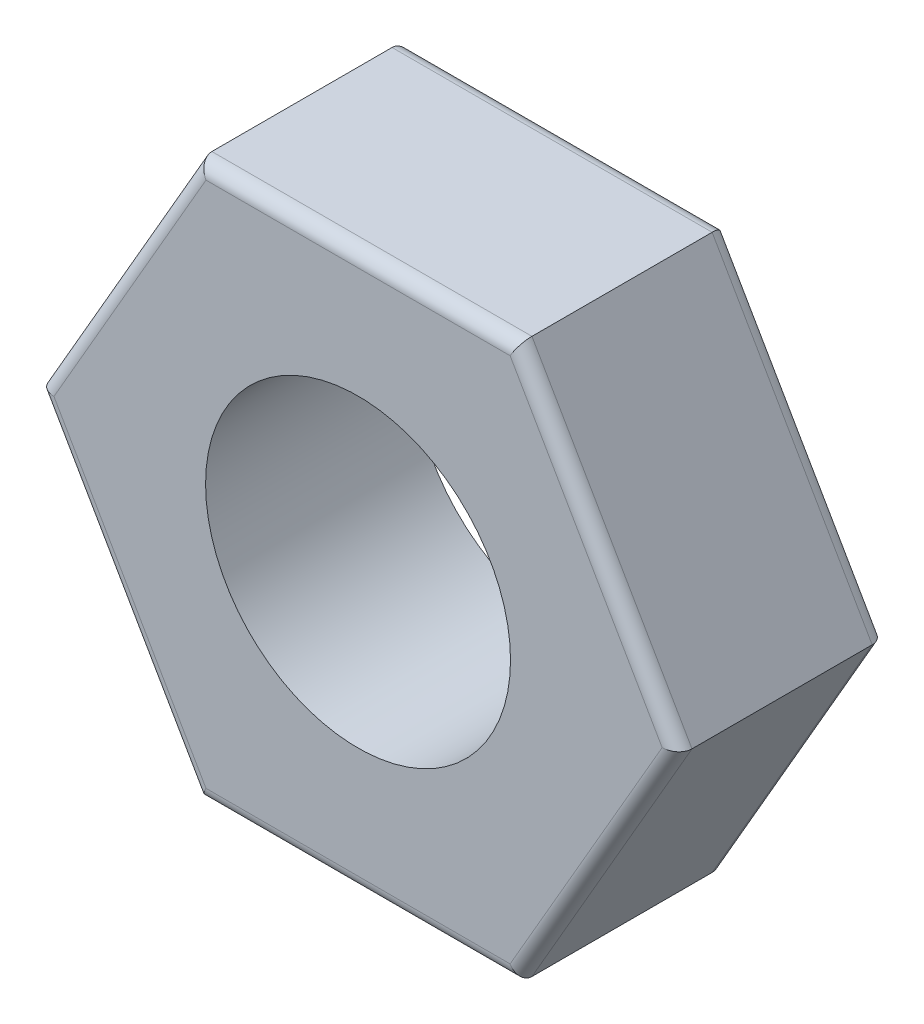
ISO-10303-21;
HEADER;
FILE_DESCRIPTION(('STEP AP214'),'2;1');
FILE_NAME('part.step','',(''),(''),'','','');
FILE_SCHEMA(('AUTOMOTIVE_DESIGN { 1 0 10303 214 1 1 1 1 }'));
ENDSEC;
DATA;
#1=APPLICATION_CONTEXT('core data for automotive mechanical design processes');
#2=APPLICATION_PROTOCOL_DEFINITION('international standard','automotive_design',2000,#1);
#3=PRODUCT_CONTEXT('',#1,'mechanical');
#4=PRODUCT('Part','Part','',(#3));
#5=PRODUCT_RELATED_PRODUCT_CATEGORY('part','',(#4));
#6=PRODUCT_DEFINITION_FORMATION('','',#4);
#7=PRODUCT_DEFINITION_CONTEXT('part definition',#1,'design');
#8=PRODUCT_DEFINITION('design','',#6,#7);
#9=PRODUCT_DEFINITION_SHAPE('','',#8);
#10=(LENGTH_UNIT() NAMED_UNIT(*) SI_UNIT(.MILLI.,.METRE.));
#11=(NAMED_UNIT(*) PLANE_ANGLE_UNIT() SI_UNIT($,.RADIAN.));
#12=(NAMED_UNIT(*) SI_UNIT($,.STERADIAN.) SOLID_ANGLE_UNIT());
#13=UNCERTAINTY_MEASURE_WITH_UNIT(LENGTH_MEASURE(1.E-05),#10,'distance_accuracy_value','');
#14=(GEOMETRIC_REPRESENTATION_CONTEXT(3) GLOBAL_UNCERTAINTY_ASSIGNED_CONTEXT((#13)) GLOBAL_UNIT_ASSIGNED_CONTEXT((#10,
#11,#12)) REPRESENTATION_CONTEXT('',''));
#15=CARTESIAN_POINT('',(0.,0.,0.));
#16=DIRECTION('',(0.,0.,1.));
#17=DIRECTION('',(1.,0.,0.));
#18=AXIS2_PLACEMENT_3D('',#15,#16,#17);
#19=CARTESIAN_POINT('',(-11.5470053837925,-20.,15.));
#20=DIRECTION('',(0.,1.,0.));
#21=DIRECTION('',(-1.,0.,0.));
#22=AXIS2_PLACEMENT_3D('',#19,#20,#21);
#23=PLANE('',#22);
#24=DIRECTION('',(0.,0.,-1.));
#25=VECTOR('',#24,1.);
#26=CARTESIAN_POINT('',(-11.5470053837925,-20.,15.));
#27=LINE('',#26,#25);
#28=CARTESIAN_POINT('',(-11.5470053837925,-20.,14.));
#29=VERTEX_POINT('',#28);
#30=CARTESIAN_POINT('',(-11.5470053837925,-20.,1.));
#31=VERTEX_POINT('',#30);
#32=EDGE_CURVE('E176',#29,#31,#27,.T.);
#33=ORIENTED_EDGE('',*,*,#32,.T.);
#34=DIRECTION('',(1.,0.,0.));
#35=VECTOR('',#34,1.);
#36=CARTESIAN_POINT('',(-11.5470053837925,-20.,1.));
#37=LINE('',#36,#35);
#38=CARTESIAN_POINT('',(11.5470053837925,-20.,1.));
#39=VERTEX_POINT('',#38);
#40=EDGE_CURVE('E206',#31,#39,#37,.T.);
#41=ORIENTED_EDGE('',*,*,#40,.T.);
#42=DIRECTION('',(0.,0.,-1.));
#43=VECTOR('',#42,1.);
#44=CARTESIAN_POINT('',(11.5470053837925,-20.,15.));
#45=LINE('',#44,#43);
#46=CARTESIAN_POINT('',(11.5470053837925,-20.,14.));
#47=VERTEX_POINT('',#46);
#48=EDGE_CURVE('E158',#47,#39,#45,.T.);
#49=ORIENTED_EDGE('',*,*,#48,.F.);
#50=DIRECTION('',(1.,0.,0.));
#51=VECTOR('',#50,1.);
#52=CARTESIAN_POINT('',(-11.5470053837925,-20.,14.));
#53=LINE('',#52,#51);
#54=EDGE_CURVE('E208',#47,#29,#53,.F.);
#55=ORIENTED_EDGE('',*,*,#54,.T.);
#56=EDGE_LOOP('',(#33,#41,#49,#55));
#57=FACE_BOUND('',#56,.T.);
#58=ADVANCED_FACE('F34',(#57),#23,.F.);
#59=CARTESIAN_POINT('',(11.5470053837925,-20.,15.));
#60=DIRECTION('',(-0.866025403784439,0.5,0.));
#61=DIRECTION('',(-0.5,-0.866025403784439,0.));
#62=AXIS2_PLACEMENT_3D('',#59,#60,#61);
#63=PLANE('',#62);
#64=ORIENTED_EDGE('',*,*,#48,.T.);
#65=DIRECTION('',(0.5,0.866025403784439,0.));
#66=VECTOR('',#65,1.);
#67=CARTESIAN_POINT('',(11.5470053837925,-20.,1.));
#68=LINE('',#67,#66);
#69=CARTESIAN_POINT('',(23.094010767585,0.,1.));
#70=VERTEX_POINT('',#69);
#71=EDGE_CURVE('E210',#39,#70,#68,.T.);
#72=ORIENTED_EDGE('',*,*,#71,.T.);
#73=DIRECTION('',(0.,0.,-1.));
#74=VECTOR('',#73,1.);
#75=CARTESIAN_POINT('',(23.094010767585,0.,15.));
#76=LINE('',#75,#74);
#77=CARTESIAN_POINT('',(23.094010767585,0.,14.));
#78=VERTEX_POINT('',#77);
#79=EDGE_CURVE('E148',#78,#70,#76,.T.);
#80=ORIENTED_EDGE('',*,*,#79,.F.);
#81=DIRECTION('',(0.5,0.866025403784439,0.));
#82=VECTOR('',#81,1.);
#83=CARTESIAN_POINT('',(11.5470053837925,-20.,14.));
#84=LINE('',#83,#82);
#85=EDGE_CURVE('E212',#78,#47,#84,.F.);
#86=ORIENTED_EDGE('',*,*,#85,.T.);
#87=EDGE_LOOP('',(#64,#72,#80,#86));
#88=FACE_BOUND('',#87,.T.);
#89=ADVANCED_FACE('F267',(#88),#63,.F.);
#90=CARTESIAN_POINT('',(23.094010767585,0.,15.));
#91=DIRECTION('',(-0.866025403784439,-0.5,0.));
#92=DIRECTION('',(0.5,-0.866025403784439,0.));
#93=AXIS2_PLACEMENT_3D('',#90,#91,#92);
#94=PLANE('',#93);
#95=ORIENTED_EDGE('',*,*,#79,.T.);
#96=DIRECTION('',(-0.5,0.866025403784439,0.));
#97=VECTOR('',#96,1.);
#98=CARTESIAN_POINT('',(23.094010767585,0.,1.));
#99=LINE('',#98,#97);
#100=CARTESIAN_POINT('',(11.5470053837925,20.,1.));
#101=VERTEX_POINT('',#100);
#102=EDGE_CURVE('E147',#70,#101,#99,.T.);
#103=ORIENTED_EDGE('',*,*,#102,.T.);
#104=DIRECTION('',(0.,0.,-1.));
#105=VECTOR('',#104,1.);
#106=CARTESIAN_POINT('',(11.5470053837925,20.,15.));
#107=LINE('',#106,#105);
#108=CARTESIAN_POINT('',(11.5470053837925,20.,14.));
#109=VERTEX_POINT('',#108);
#110=EDGE_CURVE('E129',#109,#101,#107,.T.);
#111=ORIENTED_EDGE('',*,*,#110,.F.);
#112=DIRECTION('',(-0.5,0.866025403784439,0.));
#113=VECTOR('',#112,1.);
#114=CARTESIAN_POINT('',(23.094010767585,0.,14.));
#115=LINE('',#114,#113);
#116=EDGE_CURVE('E144',#109,#78,#115,.F.);
#117=ORIENTED_EDGE('',*,*,#116,.T.);
#118=EDGE_LOOP('',(#95,#103,#111,#117));
#119=FACE_BOUND('',#118,.T.);
#120=ADVANCED_FACE('F143',(#119),#94,.F.);
#121=CARTESIAN_POINT('',(11.5470053837925,20.,15.));
#122=DIRECTION('',(0.,-1.,0.));
#123=DIRECTION('',(0.,0.,-1.));
#124=AXIS2_PLACEMENT_3D('',#121,#122,#123);
#125=PLANE('',#124);
#126=ORIENTED_EDGE('',*,*,#110,.T.);
#127=DIRECTION('',(-1.,0.,0.));
#128=VECTOR('',#127,1.);
#129=CARTESIAN_POINT('',(11.5470053837925,20.,1.));
#130=LINE('',#129,#128);
#131=CARTESIAN_POINT('',(-11.5470053837925,20.,1.));
#132=VERTEX_POINT('',#131);
#133=EDGE_CURVE('E136',#101,#132,#130,.T.);
#134=ORIENTED_EDGE('',*,*,#133,.T.);
#135=DIRECTION('',(0.,0.,-1.));
#136=VECTOR('',#135,1.);
#137=CARTESIAN_POINT('',(-11.5470053837925,20.,15.));
#138=LINE('',#137,#136);
#139=CARTESIAN_POINT('',(-11.5470053837925,20.,14.));
#140=VERTEX_POINT('',#139);
#141=EDGE_CURVE('E131',#140,#132,#138,.T.);
#142=ORIENTED_EDGE('',*,*,#141,.F.);
#143=DIRECTION('',(-1.,0.,0.));
#144=VECTOR('',#143,1.);
#145=CARTESIAN_POINT('',(11.5470053837925,20.,14.));
#146=LINE('',#145,#144);
#147=EDGE_CURVE('E126',#140,#109,#146,.F.);
#148=ORIENTED_EDGE('',*,*,#147,.T.);
#149=EDGE_LOOP('',(#126,#134,#142,#148));
#150=FACE_BOUND('',#149,.T.);
#151=ADVANCED_FACE('F128',(#150),#125,.F.);
#152=CARTESIAN_POINT('',(-11.5470053837925,20.,15.));
#153=DIRECTION('',(0.866025403784439,-0.5,0.));
#154=DIRECTION('',(0.5,0.866025403784439,0.));
#155=AXIS2_PLACEMENT_3D('',#152,#153,#154);
#156=PLANE('',#155);
#157=ORIENTED_EDGE('',*,*,#141,.T.);
#158=DIRECTION('',(-0.5,-0.866025403784439,0.));
#159=VECTOR('',#158,1.);
#160=CARTESIAN_POINT('',(-11.5470053837925,20.,1.));
#161=LINE('',#160,#159);
#162=CARTESIAN_POINT('',(-23.094010767585,0.,1.));
#163=VERTEX_POINT('',#162);
#164=EDGE_CURVE('E137',#132,#163,#161,.T.);
#165=ORIENTED_EDGE('',*,*,#164,.T.);
#166=DIRECTION('',(0.,0.,-1.));
#167=VECTOR('',#166,1.);
#168=CARTESIAN_POINT('',(-23.094010767585,0.,15.));
#169=LINE('',#168,#167);
#170=CARTESIAN_POINT('',(-23.094010767585,0.,14.));
#171=VERTEX_POINT('',#170);
#172=EDGE_CURVE('E232',#171,#163,#169,.T.);
#173=ORIENTED_EDGE('',*,*,#172,.F.);
#174=DIRECTION('',(-0.5,-0.866025403784439,0.));
#175=VECTOR('',#174,1.);
#176=CARTESIAN_POINT('',(-11.5470053837925,20.,14.));
#177=LINE('',#176,#175);
#178=EDGE_CURVE('E200',#171,#140,#177,.F.);
#179=ORIENTED_EDGE('',*,*,#178,.T.);
#180=EDGE_LOOP('',(#157,#165,#173,#179));
#181=FACE_BOUND('',#180,.T.);
#182=ADVANCED_FACE('F332',(#181),#156,.F.);
#183=CARTESIAN_POINT('',(-23.094010767585,0.,15.));
#184=DIRECTION('',(0.866025403784438,0.5,0.));
#185=DIRECTION('',(-0.5,0.866025403784439,0.));
#186=AXIS2_PLACEMENT_3D('',#183,#184,#185);
#187=PLANE('',#186);
#188=ORIENTED_EDGE('',*,*,#172,.T.);
#189=DIRECTION('',(0.5,-0.866025403784439,0.));
#190=VECTOR('',#189,1.);
#191=CARTESIAN_POINT('',(-23.094010767585,0.,1.));
#192=LINE('',#191,#190);
#193=EDGE_CURVE('E202',#163,#31,#192,.T.);
#194=ORIENTED_EDGE('',*,*,#193,.T.);
#195=ORIENTED_EDGE('',*,*,#32,.F.);
#196=DIRECTION('',(0.5,-0.866025403784439,0.));
#197=VECTOR('',#196,1.);
#198=CARTESIAN_POINT('',(-23.094010767585,0.,14.));
#199=LINE('',#198,#197);
#200=EDGE_CURVE('E204',#29,#171,#199,.F.);
#201=ORIENTED_EDGE('',*,*,#200,.T.);
#202=EDGE_LOOP('',(#188,#194,#195,#201));
#203=FACE_BOUND('',#202,.T.);
#204=ADVANCED_FACE('F255',(#203),#187,.F.);
#205=CARTESIAN_POINT('',(0.,0.,15.));
#206=DIRECTION('',(0.,0.,1.));
#207=DIRECTION('',(1.,0.,0.));
#208=AXIS2_PLACEMENT_3D('',#205,#206,#207);
#209=PLANE('',#208);
#210=CARTESIAN_POINT('',(0.,0.,15.));
#211=DIRECTION('',(0.,0.,1.));
#212=DIRECTION('',(1.,0.,0.));
#213=AXIS2_PLACEMENT_3D('',#210,#211,#212);
#214=CIRCLE('',#213,11.);
#215=CARTESIAN_POINT('',(11.,0.,15.));
#216=VERTEX_POINT('',#215);
#217=EDGE_CURVE('E237',#216,#216,#214,.T.);
#218=ORIENTED_EDGE('',*,*,#217,.F.);
#219=EDGE_LOOP('',(#218));
#220=FACE_BOUND('',#219,.T.);
#221=DIRECTION('',(-1.,0.,0.));
#222=VECTOR('',#221,1.);
#223=CARTESIAN_POINT('',(-11.5470053837925,19.,15.));
#224=LINE('',#223,#222);
#225=CARTESIAN_POINT('',(10.9696551146029,19.,15.));
#226=VERTEX_POINT('',#225);
#227=CARTESIAN_POINT('',(-10.9696551146029,19.,15.));
#228=VERTEX_POINT('',#227);
#229=EDGE_CURVE('E161',#226,#228,#224,.T.);
#230=ORIENTED_EDGE('',*,*,#229,.T.);
#231=DIRECTION('',(-0.5,-0.866025403784439,0.));
#232=VECTOR('',#231,1.);
#233=CARTESIAN_POINT('',(-22.2279853638006,-0.5,15.));
#234=LINE('',#233,#232);
#235=CARTESIAN_POINT('',(-21.9393102292058,0.,15.));
#236=VERTEX_POINT('',#235);
#237=EDGE_CURVE('E11',#228,#236,#234,.T.);
#238=ORIENTED_EDGE('',*,*,#237,.T.);
#239=DIRECTION('',(0.5,-0.866025403784439,0.));
#240=VECTOR('',#239,1.);
#241=CARTESIAN_POINT('',(-10.6809799800081,-19.5,15.));
#242=LINE('',#241,#240);
#243=CARTESIAN_POINT('',(-10.9696551146029,-19.,15.));
#244=VERTEX_POINT('',#243);
#245=EDGE_CURVE('E43',#236,#244,#242,.T.);
#246=ORIENTED_EDGE('',*,*,#245,.T.);
#247=DIRECTION('',(1.,0.,0.));
#248=VECTOR('',#247,1.);
#249=CARTESIAN_POINT('',(11.5470053837925,-19.,15.));
#250=LINE('',#249,#248);
#251=CARTESIAN_POINT('',(10.9696551146029,-19.,15.));
#252=VERTEX_POINT('',#251);
#253=EDGE_CURVE('E191',#244,#252,#250,.T.);
#254=ORIENTED_EDGE('',*,*,#253,.T.);
#255=DIRECTION('',(0.5,0.866025403784439,0.));
#256=VECTOR('',#255,1.);
#257=CARTESIAN_POINT('',(22.2279853638006,0.500000000000002,15.));
#258=LINE('',#257,#256);
#259=CARTESIAN_POINT('',(21.9393102292058,0.,15.));
#260=VERTEX_POINT('',#259);
#261=EDGE_CURVE('E193',#252,#260,#258,.T.);
#262=ORIENTED_EDGE('',*,*,#261,.T.);
#263=DIRECTION('',(-0.5,0.866025403784439,0.));
#264=VECTOR('',#263,1.);
#265=CARTESIAN_POINT('',(10.6809799800081,19.5,15.));
#266=LINE('',#265,#264);
#267=EDGE_CURVE('E195',#260,#226,#266,.T.);
#268=ORIENTED_EDGE('',*,*,#267,.T.);
#269=EDGE_LOOP('',(#230,#238,#246,#254,#262,#268));
#270=FACE_BOUND('',#269,.T.);
#271=ADVANCED_FACE('F253',(#220,#270),#209,.T.);
#272=CARTESIAN_POINT('',(0.,0.,0.));
#273=DIRECTION('',(0.,0.,1.));
#274=DIRECTION('',(1.,0.,0.));
#275=AXIS2_PLACEMENT_3D('',#272,#273,#274);
#276=PLANE('',#275);
#277=CARTESIAN_POINT('',(0.,0.,0.));
#278=DIRECTION('',(0.,0.,1.));
#279=DIRECTION('',(1.,0.,0.));
#280=AXIS2_PLACEMENT_3D('',#277,#278,#279);
#281=CIRCLE('',#280,11.);
#282=CARTESIAN_POINT('',(11.,0.,0.));
#283=VERTEX_POINT('',#282);
#284=EDGE_CURVE('E172',#283,#283,#281,.T.);
#285=ORIENTED_EDGE('',*,*,#284,.T.);
#286=EDGE_LOOP('',(#285));
#287=FACE_BOUND('',#286,.T.);
#288=DIRECTION('',(-1.,0.,0.));
#289=VECTOR('',#288,1.);
#290=CARTESIAN_POINT('',(0.,19.,0.));
#291=LINE('',#290,#289);
#292=CARTESIAN_POINT('',(-10.9696551146029,19.,0.));
#293=VERTEX_POINT('',#292);
#294=CARTESIAN_POINT('',(10.9696551146029,19.,0.));
#295=VERTEX_POINT('',#294);
#296=EDGE_CURVE('E225',#293,#295,#291,.F.);
#297=ORIENTED_EDGE('',*,*,#296,.T.);
#298=DIRECTION('',(-0.5,0.866025403784439,0.));
#299=VECTOR('',#298,1.);
#300=CARTESIAN_POINT('',(16.4544826719043,9.5,0.));
#301=LINE('',#300,#299);
#302=CARTESIAN_POINT('',(21.9393102292058,0.,0.));
#303=VERTEX_POINT('',#302);
#304=EDGE_CURVE('E214',#295,#303,#301,.F.);
#305=ORIENTED_EDGE('',*,*,#304,.T.);
#306=DIRECTION('',(0.5,0.866025403784439,0.));
#307=VECTOR('',#306,1.);
#308=CARTESIAN_POINT('',(16.4544826719043,-9.5,0.));
#309=LINE('',#308,#307);
#310=CARTESIAN_POINT('',(10.9696551146029,-19.,0.));
#311=VERTEX_POINT('',#310);
#312=EDGE_CURVE('E217',#303,#311,#309,.F.);
#313=ORIENTED_EDGE('',*,*,#312,.T.);
#314=DIRECTION('',(1.,0.,0.));
#315=VECTOR('',#314,1.);
#316=CARTESIAN_POINT('',(0.,-19.,0.));
#317=LINE('',#316,#315);
#318=CARTESIAN_POINT('',(-10.9696551146029,-19.,0.));
#319=VERTEX_POINT('',#318);
#320=EDGE_CURVE('E219',#311,#319,#317,.F.);
#321=ORIENTED_EDGE('',*,*,#320,.T.);
#322=DIRECTION('',(0.5,-0.866025403784439,0.));
#323=VECTOR('',#322,1.);
#324=CARTESIAN_POINT('',(-16.4544826719043,-9.5,0.));
#325=LINE('',#324,#323);
#326=CARTESIAN_POINT('',(-21.9393102292058,0.,0.));
#327=VERTEX_POINT('',#326);
#328=EDGE_CURVE('E221',#319,#327,#325,.F.);
#329=ORIENTED_EDGE('',*,*,#328,.T.);
#330=DIRECTION('',(-0.5,-0.866025403784439,0.));
#331=VECTOR('',#330,1.);
#332=CARTESIAN_POINT('',(-16.4544826719043,9.5,0.));
#333=LINE('',#332,#331);
#334=EDGE_CURVE('E223',#327,#293,#333,.F.);
#335=ORIENTED_EDGE('',*,*,#334,.T.);
#336=EDGE_LOOP('',(#297,#305,#313,#321,#329,#335));
#337=FACE_BOUND('',#336,.T.);
#338=ADVANCED_FACE('F243',(#287,#337),#276,.F.);
#339=CARTESIAN_POINT('',(-22.2279853638006,0.500000000000004,1.));
#340=DIRECTION('',(0.5,-0.866025403784439,0.));
#341=DIRECTION('',(0.866025403784438,0.5,0.));
#342=AXIS2_PLACEMENT_3D('',#339,#340,#341);
#343=CYLINDRICAL_SURFACE('',#342,1.);
#344=CARTESIAN_POINT('',(-21.9393102292058,0.,1.));
#345=DIRECTION('',(0.,-1.,0.));
#346=DIRECTION('',(-1.,0.,0.));
#347=AXIS2_PLACEMENT_3D('',#344,#345,#346);
#348=ELLIPSE('',#347,1.15470053837925,1.);
#349=EDGE_CURVE('E177',#327,#163,#348,.F.);
#350=ORIENTED_EDGE('',*,*,#349,.F.);
#351=ORIENTED_EDGE('',*,*,#328,.F.);
#352=CARTESIAN_POINT('',(-10.9696551146029,-19.,1.));
#353=DIRECTION('',(0.866025403784439,-0.5,0.));
#354=DIRECTION('',(-0.5,-0.866025403784439,0.));
#355=AXIS2_PLACEMENT_3D('',#352,#353,#354);
#356=ELLIPSE('',#355,1.15470053837925,1.);
#357=EDGE_CURVE('E173',#31,#319,#356,.T.);
#358=ORIENTED_EDGE('',*,*,#357,.F.);
#359=ORIENTED_EDGE('',*,*,#193,.F.);
#360=EDGE_LOOP('',(#350,#351,#358,#359));
#361=FACE_BOUND('',#360,.T.);
#362=ADVANCED_FACE('F295',(#361),#343,.T.);
#363=CARTESIAN_POINT('',(-11.5470053837925,-19.,1.));
#364=DIRECTION('',(1.,0.,0.));
#365=DIRECTION('',(0.,1.,0.));
#366=AXIS2_PLACEMENT_3D('',#363,#364,#365);
#367=CYLINDRICAL_SURFACE('',#366,1.);
#368=ORIENTED_EDGE('',*,*,#357,.T.);
#369=ORIENTED_EDGE('',*,*,#320,.F.);
#370=CARTESIAN_POINT('',(10.9696551146029,-19.,1.));
#371=DIRECTION('',(0.866025403784438,0.5,0.));
#372=DIRECTION('',(0.5,-0.866025403784439,0.));
#373=AXIS2_PLACEMENT_3D('',#370,#371,#372);
#374=ELLIPSE('',#373,1.15470053837925,1.);
#375=EDGE_CURVE('E180',#39,#311,#374,.T.);
#376=ORIENTED_EDGE('',*,*,#375,.F.);
#377=ORIENTED_EDGE('',*,*,#40,.F.);
#378=EDGE_LOOP('',(#368,#369,#376,#377));
#379=FACE_BOUND('',#378,.T.);
#380=ADVANCED_FACE('F292',(#379),#367,.T.);
#381=CARTESIAN_POINT('',(-10.6809799800081,19.5,1.));
#382=DIRECTION('',(-0.5,-0.866025403784439,0.));
#383=DIRECTION('',(0.866025403784439,-0.5,0.));
#384=AXIS2_PLACEMENT_3D('',#381,#382,#383);
#385=CYLINDRICAL_SURFACE('',#384,1.);
#386=ORIENTED_EDGE('',*,*,#349,.T.);
#387=ORIENTED_EDGE('',*,*,#164,.F.);
#388=CARTESIAN_POINT('',(-10.9696551146029,19.,1.));
#389=DIRECTION('',(-0.866025403784439,-0.5,0.));
#390=DIRECTION('',(-0.5,0.866025403784439,0.));
#391=AXIS2_PLACEMENT_3D('',#388,#389,#390);
#392=ELLIPSE('',#391,1.15470053837925,1.);
#393=EDGE_CURVE('E183',#293,#132,#392,.F.);
#394=ORIENTED_EDGE('',*,*,#393,.F.);
#395=ORIENTED_EDGE('',*,*,#334,.F.);
#396=EDGE_LOOP('',(#386,#387,#394,#395));
#397=FACE_BOUND('',#396,.T.);
#398=ADVANCED_FACE('F288',(#397),#385,.T.);
#399=CARTESIAN_POINT('',(10.6809799800081,-19.5,1.));
#400=DIRECTION('',(0.5,0.866025403784439,0.));
#401=DIRECTION('',(-0.866025403784439,0.5,0.));
#402=AXIS2_PLACEMENT_3D('',#399,#400,#401);
#403=CYLINDRICAL_SURFACE('',#402,1.);
#404=ORIENTED_EDGE('',*,*,#375,.T.);
#405=ORIENTED_EDGE('',*,*,#312,.F.);
#406=CARTESIAN_POINT('',(21.9393102292058,0.,1.));
#407=DIRECTION('',(0.,1.,0.));
#408=DIRECTION('',(1.,0.,0.));
#409=AXIS2_PLACEMENT_3D('',#406,#407,#408);
#410=ELLIPSE('',#409,1.15470053837925,1.);
#411=EDGE_CURVE('E186',#70,#303,#410,.T.);
#412=ORIENTED_EDGE('',*,*,#411,.F.);
#413=ORIENTED_EDGE('',*,*,#71,.F.);
#414=EDGE_LOOP('',(#404,#405,#412,#413));
#415=FACE_BOUND('',#414,.T.);
#416=ADVANCED_FACE('F284',(#415),#403,.T.);
#417=CARTESIAN_POINT('',(11.5470053837925,19.,1.));
#418=DIRECTION('',(-1.,0.,0.));
#419=DIRECTION('',(0.,0.,1.));
#420=AXIS2_PLACEMENT_3D('',#417,#418,#419);
#421=CYLINDRICAL_SURFACE('',#420,1.);
#422=ORIENTED_EDGE('',*,*,#393,.T.);
#423=ORIENTED_EDGE('',*,*,#133,.F.);
#424=CARTESIAN_POINT('',(10.9696551146029,19.,1.));
#425=DIRECTION('',(-0.866025403784439,0.5,0.));
#426=DIRECTION('',(-0.5,-0.866025403784439,0.));
#427=AXIS2_PLACEMENT_3D('',#424,#425,#426);
#428=ELLIPSE('',#427,1.15470053837925,1.);
#429=EDGE_CURVE('E188',#295,#101,#428,.F.);
#430=ORIENTED_EDGE('',*,*,#429,.F.);
#431=ORIENTED_EDGE('',*,*,#296,.F.);
#432=EDGE_LOOP('',(#422,#423,#430,#431));
#433=FACE_BOUND('',#432,.T.);
#434=ADVANCED_FACE('F280',(#433),#421,.T.);
#435=CARTESIAN_POINT('',(22.2279853638006,-0.499999999999999,1.));
#436=DIRECTION('',(-0.5,0.866025403784439,0.));
#437=DIRECTION('',(-0.866025403784439,-0.5,0.));
#438=AXIS2_PLACEMENT_3D('',#435,#436,#437);
#439=CYLINDRICAL_SURFACE('',#438,1.);
#440=ORIENTED_EDGE('',*,*,#411,.T.);
#441=ORIENTED_EDGE('',*,*,#304,.F.);
#442=ORIENTED_EDGE('',*,*,#429,.T.);
#443=ORIENTED_EDGE('',*,*,#102,.F.);
#444=EDGE_LOOP('',(#440,#441,#442,#443));
#445=FACE_BOUND('',#444,.T.);
#446=ADVANCED_FACE('F277',(#445),#439,.T.);
#447=CARTESIAN_POINT('',(16.4544826719043,-9.5,14.));
#448=DIRECTION('',(-0.5,-0.866025403784439,0.));
#449=DIRECTION('',(0.866025403784439,-0.5,0.));
#450=AXIS2_PLACEMENT_3D('',#447,#448,#449);
#451=CYLINDRICAL_SURFACE('',#450,1.);
#452=CARTESIAN_POINT('',(10.9696551146029,-19.,14.));
#453=DIRECTION('',(-0.866025403784438,-0.5,0.));
#454=DIRECTION('',(0.5,-0.866025403784439,0.));
#455=AXIS2_PLACEMENT_3D('',#452,#453,#454);
#456=ELLIPSE('',#455,1.15470053837925,1.);
#457=EDGE_CURVE('E162',#47,#252,#456,.T.);
#458=ORIENTED_EDGE('',*,*,#457,.F.);
#459=ORIENTED_EDGE('',*,*,#85,.F.);
#460=CARTESIAN_POINT('',(21.9393102292058,0.,14.));
#461=DIRECTION('',(0.,-1.,0.));
#462=DIRECTION('',(1.,0.,0.));
#463=AXIS2_PLACEMENT_3D('',#460,#461,#462);
#464=ELLIPSE('',#463,1.15470053837925,1.);
#465=EDGE_CURVE('E38',#260,#78,#464,.F.);
#466=ORIENTED_EDGE('',*,*,#465,.F.);
#467=ORIENTED_EDGE('',*,*,#261,.F.);
#468=EDGE_LOOP('',(#458,#459,#466,#467));
#469=FACE_BOUND('',#468,.T.);
#470=ADVANCED_FACE('F36',(#469),#451,.T.);
#471=CARTESIAN_POINT('',(16.4544826719043,9.5,14.));
#472=DIRECTION('',(0.5,-0.866025403784439,0.));
#473=DIRECTION('',(0.866025403784439,0.5,0.));
#474=AXIS2_PLACEMENT_3D('',#471,#472,#473);
#475=CYLINDRICAL_SURFACE('',#474,1.);
#476=ORIENTED_EDGE('',*,*,#465,.T.);
#477=ORIENTED_EDGE('',*,*,#116,.F.);
#478=CARTESIAN_POINT('',(10.9696551146029,19.,14.));
#479=DIRECTION('',(0.866025403784439,-0.5,0.));
#480=DIRECTION('',(0.5,0.866025403784439,0.));
#481=AXIS2_PLACEMENT_3D('',#478,#479,#480);
#482=ELLIPSE('',#481,1.15470053837925,1.);
#483=EDGE_CURVE('E155',#226,#109,#482,.F.);
#484=ORIENTED_EDGE('',*,*,#483,.F.);
#485=ORIENTED_EDGE('',*,*,#267,.F.);
#486=EDGE_LOOP('',(#476,#477,#484,#485));
#487=FACE_BOUND('',#486,.T.);
#488=ADVANCED_FACE('F153',(#487),#475,.T.);
#489=CARTESIAN_POINT('',(0.,-19.,14.));
#490=DIRECTION('',(-1.,0.,0.));
#491=DIRECTION('',(0.,-1.,0.));
#492=AXIS2_PLACEMENT_3D('',#489,#490,#491);
#493=CYLINDRICAL_SURFACE('',#492,1.);
#494=ORIENTED_EDGE('',*,*,#457,.T.);
#495=ORIENTED_EDGE('',*,*,#253,.F.);
#496=CARTESIAN_POINT('',(-10.9696551146029,-19.,14.));
#497=DIRECTION('',(-0.866025403784439,0.5,0.));
#498=DIRECTION('',(-0.5,-0.866025403784439,0.));
#499=AXIS2_PLACEMENT_3D('',#496,#497,#498);
#500=ELLIPSE('',#499,1.15470053837925,1.);
#501=EDGE_CURVE('E163',#29,#244,#500,.T.);
#502=ORIENTED_EDGE('',*,*,#501,.F.);
#503=ORIENTED_EDGE('',*,*,#54,.F.);
#504=EDGE_LOOP('',(#494,#495,#502,#503));
#505=FACE_BOUND('',#504,.T.);
#506=ADVANCED_FACE('F327',(#505),#493,.T.);
#507=CARTESIAN_POINT('',(0.,19.,14.));
#508=DIRECTION('',(1.,0.,0.));
#509=DIRECTION('',(0.,0.,-1.));
#510=AXIS2_PLACEMENT_3D('',#507,#508,#509);
#511=CYLINDRICAL_SURFACE('',#510,1.);
#512=ORIENTED_EDGE('',*,*,#483,.T.);
#513=ORIENTED_EDGE('',*,*,#147,.F.);
#514=CARTESIAN_POINT('',(-10.9696551146029,19.,14.));
#515=DIRECTION('',(0.866025403784439,0.5,0.));
#516=DIRECTION('',(0.5,-0.866025403784439,0.));
#517=AXIS2_PLACEMENT_3D('',#514,#515,#516);
#518=ELLIPSE('',#517,1.15470053837925,1.);
#519=EDGE_CURVE('E167',#228,#140,#518,.F.);
#520=ORIENTED_EDGE('',*,*,#519,.F.);
#521=ORIENTED_EDGE('',*,*,#229,.F.);
#522=EDGE_LOOP('',(#512,#513,#520,#521));
#523=FACE_BOUND('',#522,.T.);
#524=ADVANCED_FACE('F160',(#523),#511,.T.);
#525=CARTESIAN_POINT('',(-16.4544826719043,-9.5,14.));
#526=DIRECTION('',(-0.5,0.866025403784439,0.));
#527=DIRECTION('',(-0.866025403784438,-0.5,0.));
#528=AXIS2_PLACEMENT_3D('',#525,#526,#527);
#529=CYLINDRICAL_SURFACE('',#528,1.);
#530=ORIENTED_EDGE('',*,*,#501,.T.);
#531=ORIENTED_EDGE('',*,*,#245,.F.);
#532=CARTESIAN_POINT('',(-21.9393102292058,0.,14.));
#533=DIRECTION('',(0.,1.,0.));
#534=DIRECTION('',(-1.,0.,0.));
#535=AXIS2_PLACEMENT_3D('',#532,#533,#534);
#536=ELLIPSE('',#535,1.15470053837925,1.);
#537=EDGE_CURVE('E51',#171,#236,#536,.T.);
#538=ORIENTED_EDGE('',*,*,#537,.F.);
#539=ORIENTED_EDGE('',*,*,#200,.F.);
#540=EDGE_LOOP('',(#530,#531,#538,#539));
#541=FACE_BOUND('',#540,.T.);
#542=ADVANCED_FACE('F258',(#541),#529,.T.);
#543=CARTESIAN_POINT('',(-16.4544826719043,9.5,14.));
#544=DIRECTION('',(0.5,0.866025403784439,0.));
#545=DIRECTION('',(-0.866025403784439,0.5,0.));
#546=AXIS2_PLACEMENT_3D('',#543,#544,#545);
#547=CYLINDRICAL_SURFACE('',#546,1.);
#548=ORIENTED_EDGE('',*,*,#519,.T.);
#549=ORIENTED_EDGE('',*,*,#178,.F.);
#550=ORIENTED_EDGE('',*,*,#537,.T.);
#551=ORIENTED_EDGE('',*,*,#237,.F.);
#552=EDGE_LOOP('',(#548,#549,#550,#551));
#553=FACE_BOUND('',#552,.T.);
#554=ADVANCED_FACE('F249',(#553),#547,.T.);
#555=CARTESIAN_POINT('',(0.,0.,0.));
#556=DIRECTION('',(0.,0.,1.));
#557=DIRECTION('',(1.,0.,0.));
#558=AXIS2_PLACEMENT_3D('',#555,#556,#557);
#559=CYLINDRICAL_SURFACE('',#558,11.);
#560=ORIENTED_EDGE('',*,*,#284,.F.);
#561=EDGE_LOOP('',(#560));
#562=FACE_BOUND('',#561,.T.);
#563=ORIENTED_EDGE('',*,*,#217,.T.);
#564=EDGE_LOOP('',(#563));
#565=FACE_BOUND('',#564,.T.);
#566=ADVANCED_FACE('F246',(#562,#565),#559,.F.);
#567=CLOSED_SHELL('',(#58,#89,#120,#151,#182,#204,#271,#338,#362,#380,#398,#416,#434,#446,#470,
#488,#506,#524,#542,#554,#566));
#568=MANIFOLD_SOLID_BREP('B2',#567);
#569=ADVANCED_BREP_SHAPE_REPRESENTATION('',(#18,#568),#14);
#570=SHAPE_DEFINITION_REPRESENTATION(#9,#569);
ENDSEC;
END-ISO-10303-21;
